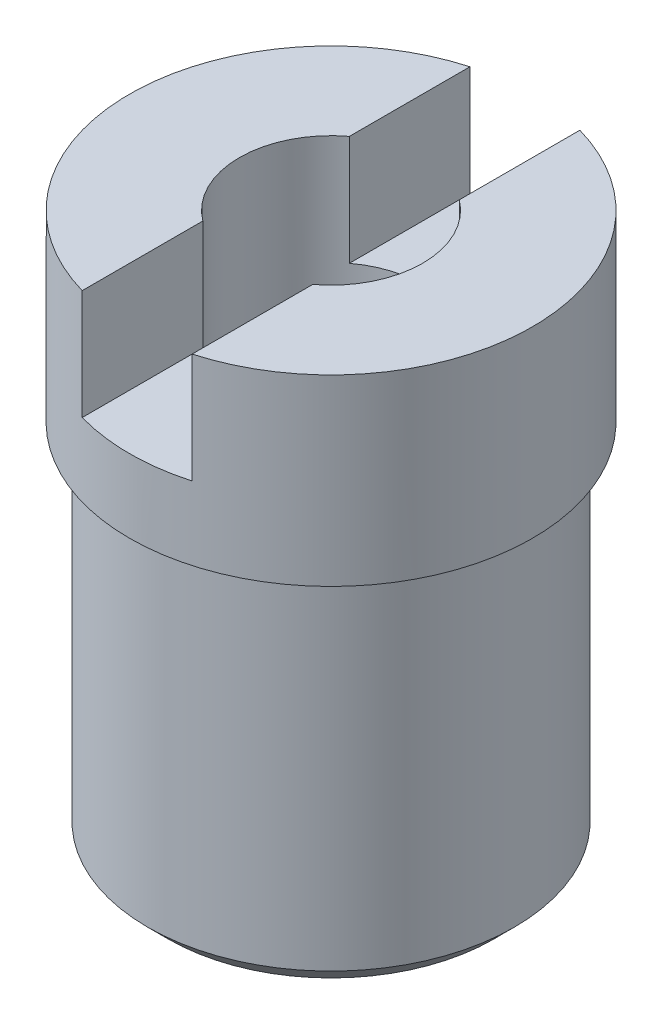
ISO-10303-21;
HEADER;
FILE_DESCRIPTION(('STEP AP214'),'2;1');
FILE_NAME('part.step','',(''),(''),'','','');
FILE_SCHEMA(('AUTOMOTIVE_DESIGN { 1 0 10303 214 1 1 1 1 }'));
ENDSEC;
DATA;
#1=APPLICATION_CONTEXT('core data for automotive mechanical design processes');
#2=APPLICATION_PROTOCOL_DEFINITION('international standard','automotive_design',2000,#1);
#3=PRODUCT_CONTEXT('',#1,'mechanical');
#4=PRODUCT('Part','Part','',(#3));
#5=PRODUCT_RELATED_PRODUCT_CATEGORY('part','',(#4));
#6=PRODUCT_DEFINITION_FORMATION('','',#4);
#7=PRODUCT_DEFINITION_CONTEXT('part definition',#1,'design');
#8=PRODUCT_DEFINITION('design','',#6,#7);
#9=PRODUCT_DEFINITION_SHAPE('','',#8);
#10=(LENGTH_UNIT() NAMED_UNIT(*) SI_UNIT(.MILLI.,.METRE.));
#11=(NAMED_UNIT(*) PLANE_ANGLE_UNIT() SI_UNIT($,.RADIAN.));
#12=(NAMED_UNIT(*) SI_UNIT($,.STERADIAN.) SOLID_ANGLE_UNIT());
#13=UNCERTAINTY_MEASURE_WITH_UNIT(LENGTH_MEASURE(1.E-05),#10,'distance_accuracy_value','');
#14=(GEOMETRIC_REPRESENTATION_CONTEXT(3) GLOBAL_UNCERTAINTY_ASSIGNED_CONTEXT((#13)) GLOBAL_UNIT_ASSIGNED_CONTEXT((#10,
#11,#12)) REPRESENTATION_CONTEXT('',''));
#15=CARTESIAN_POINT('',(0.,0.,0.));
#16=DIRECTION('',(0.,0.,1.));
#17=DIRECTION('',(1.,0.,0.));
#18=AXIS2_PLACEMENT_3D('',#15,#16,#17);
#19=CARTESIAN_POINT('',(0.,0.,0.));
#20=DIRECTION('',(0.,1.,0.));
#21=DIRECTION('',(0.,0.,1.));
#22=AXIS2_PLACEMENT_3D('',#19,#20,#21);
#23=PLANE('',#22);
#24=CARTESIAN_POINT('',(0.,0.,0.));
#25=DIRECTION('',(0.,1.,0.));
#26=DIRECTION('',(0.,0.,1.));
#27=AXIS2_PLACEMENT_3D('',#24,#25,#26);
#28=CIRCLE('',#27,2.5);
#29=CARTESIAN_POINT('',(1.0226917607471,0.,2.28125));
#30=VERTEX_POINT('',#29);
#31=CARTESIAN_POINT('',(2.4869663327568,0.,-0.254947954951986));
#32=VERTEX_POINT('',#31);
#33=EDGE_CURVE('E265',#30,#32,#28,.T.);
#34=ORIENTED_EDGE('',*,*,#33,.T.);
#35=CARTESIAN_POINT('',(2.59807621135331,0.,-1.50000000000001));
#36=DIRECTION('',(0.,-1.,0.));
#37=DIRECTION('',(-0.866025403784436,0.,0.500000000000004));
#38=AXIS2_PLACEMENT_3D('',#35,#36,#37);
#39=CIRCLE('',#38,1.25);
#40=CARTESIAN_POINT('',(1.46427457200969,0.,-2.02630204504803));
#41=VERTEX_POINT('',#40);
#42=EDGE_CURVE('E170',#41,#32,#39,.T.);
#43=ORIENTED_EDGE('',*,*,#42,.F.);
#44=CARTESIAN_POINT('',(-1.46427457200972,0.,-2.02630204504801));
#45=VERTEX_POINT('',#44);
#46=EDGE_CURVE('E169',#41,#45,#28,.T.);
#47=ORIENTED_EDGE('',*,*,#46,.T.);
#48=CARTESIAN_POINT('',(-2.59807621135333,0.,-1.49999999999998));
#49=DIRECTION('',(0.,-1.,0.));
#50=DIRECTION('',(0.866025403784443,0.,0.499999999999992));
#51=AXIS2_PLACEMENT_3D('',#48,#49,#50);
#52=CIRCLE('',#51,1.25);
#53=CARTESIAN_POINT('',(-2.4869663327568,0.,-0.254947954951952));
#54=VERTEX_POINT('',#53);
#55=EDGE_CURVE('E159',#54,#45,#52,.T.);
#56=ORIENTED_EDGE('',*,*,#55,.F.);
#57=CARTESIAN_POINT('',(-1.0226917607471,0.,2.28125));
#58=VERTEX_POINT('',#57);
#59=EDGE_CURVE('E291',#54,#58,#28,.T.);
#60=ORIENTED_EDGE('',*,*,#59,.T.);
#61=CARTESIAN_POINT('',(0.,0.,3.));
#62=DIRECTION('',(0.,-1.,0.));
#63=DIRECTION('',(0.,0.,-1.));
#64=AXIS2_PLACEMENT_3D('',#61,#62,#63);
#65=CIRCLE('',#64,1.25);
#66=EDGE_CURVE('E172',#30,#58,#65,.T.);
#67=ORIENTED_EDGE('',*,*,#66,.F.);
#68=EDGE_LOOP('',(#34,#43,#47,#56,#60,#67));
#69=FACE_BOUND('',#68,.T.);
#70=CARTESIAN_POINT('',(0.,0.,0.));
#71=DIRECTION('',(0.,1.,0.));
#72=DIRECTION('',(0.,0.,1.));
#73=AXIS2_PLACEMENT_3D('',#70,#71,#72);
#74=CIRCLE('',#73,4.4455);
#75=CARTESIAN_POINT('',(0.,0.,4.4455));
#76=VERTEX_POINT('',#75);
#77=EDGE_CURVE('E339',#76,#76,#74,.T.);
#78=ORIENTED_EDGE('',*,*,#77,.F.);
#79=EDGE_LOOP('',(#78));
#80=FACE_BOUND('',#79,.T.);
#81=ADVANCED_FACE('F47',(#69,#80),#23,.F.);
#82=CARTESIAN_POINT('',(0.,15.,0.));
#83=DIRECTION('',(0.,1.,0.));
#84=DIRECTION('',(0.,0.,1.));
#85=AXIS2_PLACEMENT_3D('',#82,#83,#84);
#86=PLANE('',#85);
#87=DIRECTION('',(0.,0.,-1.));
#88=VECTOR('',#87,1.);
#89=CARTESIAN_POINT('',(1.5,15.,6.34091833191656));
#90=LINE('',#89,#88);
#91=CARTESIAN_POINT('',(1.5,15.,5.29150262212918));
#92=VERTEX_POINT('',#91);
#93=CARTESIAN_POINT('',(1.5,15.,2.));
#94=VERTEX_POINT('',#93);
#95=EDGE_CURVE('E305',#92,#94,#90,.T.);
#96=ORIENTED_EDGE('',*,*,#95,.F.);
#97=CARTESIAN_POINT('',(0.,15.,0.));
#98=DIRECTION('',(0.,1.,0.));
#99=DIRECTION('',(0.,0.,1.));
#100=AXIS2_PLACEMENT_3D('',#97,#98,#99);
#101=CIRCLE('',#100,5.5);
#102=CARTESIAN_POINT('',(1.5,15.,-5.29150262212918));
#103=VERTEX_POINT('',#102);
#104=EDGE_CURVE('E248',#92,#103,#101,.T.);
#105=ORIENTED_EDGE('',*,*,#104,.T.);
#106=CARTESIAN_POINT('',(1.5,15.,-2.));
#107=VERTEX_POINT('',#106);
#108=EDGE_CURVE('E306',#107,#103,#90,.T.);
#109=ORIENTED_EDGE('',*,*,#108,.F.);
#110=CARTESIAN_POINT('',(0.,15.,0.));
#111=DIRECTION('',(0.,1.,0.));
#112=DIRECTION('',(0.,0.,1.));
#113=AXIS2_PLACEMENT_3D('',#110,#111,#112);
#114=CIRCLE('',#113,2.5);
#115=EDGE_CURVE('E263',#94,#107,#114,.T.);
#116=ORIENTED_EDGE('',*,*,#115,.F.);
#117=EDGE_LOOP('',(#96,#105,#109,#116));
#118=FACE_BOUND('',#117,.T.);
#119=ADVANCED_FACE('F231',(#118),#86,.T.);
#120=DIRECTION('',(0.,0.,1.));
#121=VECTOR('',#120,1.);
#122=CARTESIAN_POINT('',(-1.5,15.,6.34091833191656));
#123=LINE('',#122,#121);
#124=CARTESIAN_POINT('',(-1.5,15.,-5.29150262212918));
#125=VERTEX_POINT('',#124);
#126=CARTESIAN_POINT('',(-1.5,15.,-2.));
#127=VERTEX_POINT('',#126);
#128=EDGE_CURVE('E318',#125,#127,#123,.T.);
#129=ORIENTED_EDGE('',*,*,#128,.F.);
#130=CARTESIAN_POINT('',(-1.5,15.,5.29150262212918));
#131=VERTEX_POINT('',#130);
#132=EDGE_CURVE('E257',#125,#131,#101,.T.);
#133=ORIENTED_EDGE('',*,*,#132,.T.);
#134=CARTESIAN_POINT('',(-1.5,15.,2.));
#135=VERTEX_POINT('',#134);
#136=EDGE_CURVE('E310',#135,#131,#123,.T.);
#137=ORIENTED_EDGE('',*,*,#136,.F.);
#138=EDGE_CURVE('E290',#127,#135,#114,.T.);
#139=ORIENTED_EDGE('',*,*,#138,.F.);
#140=EDGE_LOOP('',(#129,#133,#137,#139));
#141=FACE_BOUND('',#140,.T.);
#142=ADVANCED_FACE('F228',(#141),#86,.T.);
#143=CARTESIAN_POINT('',(0.,15.,0.));
#144=DIRECTION('',(0.,-1.,0.));
#145=DIRECTION('',(0.,0.,-1.));
#146=AXIS2_PLACEMENT_3D('',#143,#144,#145);
#147=CYLINDRICAL_SURFACE('',#146,5.5);
#148=CARTESIAN_POINT('',(0.,10.,0.));
#149=DIRECTION('',(0.,1.,0.));
#150=DIRECTION('',(0.,0.,1.));
#151=AXIS2_PLACEMENT_3D('',#148,#149,#150);
#152=CIRCLE('',#151,5.5);
#153=CARTESIAN_POINT('',(0.,10.,5.5));
#154=VERTEX_POINT('',#153);
#155=EDGE_CURVE('E243',#154,#154,#152,.T.);
#156=ORIENTED_EDGE('',*,*,#155,.T.);
#157=EDGE_LOOP('',(#156));
#158=FACE_BOUND('',#157,.T.);
#159=ORIENTED_EDGE('',*,*,#104,.F.);
#160=DIRECTION('',(0.,-1.,0.));
#161=VECTOR('',#160,1.);
#162=CARTESIAN_POINT('',(1.5,15.,5.29150262212918));
#163=LINE('',#162,#161);
#164=CARTESIAN_POINT('',(1.5,12.,5.29150262212918));
#165=VERTEX_POINT('',#164);
#166=EDGE_CURVE('E250',#92,#165,#163,.T.);
#167=ORIENTED_EDGE('',*,*,#166,.T.);
#168=CARTESIAN_POINT('',(0.,12.,0.));
#169=DIRECTION('',(0.,-1.,0.));
#170=DIRECTION('',(0.,0.,-1.));
#171=AXIS2_PLACEMENT_3D('',#168,#169,#170);
#172=CIRCLE('',#171,5.5);
#173=CARTESIAN_POINT('',(-1.5,12.,5.29150262212918));
#174=VERTEX_POINT('',#173);
#175=EDGE_CURVE('E321',#165,#174,#172,.T.);
#176=ORIENTED_EDGE('',*,*,#175,.T.);
#177=DIRECTION('',(0.,-1.,0.));
#178=VECTOR('',#177,1.);
#179=CARTESIAN_POINT('',(-1.5,15.,5.29150262212918));
#180=LINE('',#179,#178);
#181=EDGE_CURVE('E323',#174,#131,#180,.F.);
#182=ORIENTED_EDGE('',*,*,#181,.T.);
#183=ORIENTED_EDGE('',*,*,#132,.F.);
#184=DIRECTION('',(0.,-1.,0.));
#185=VECTOR('',#184,1.);
#186=CARTESIAN_POINT('',(-1.5,15.,-5.29150262212918));
#187=LINE('',#186,#185);
#188=CARTESIAN_POINT('',(-1.5,12.,-5.29150262212918));
#189=VERTEX_POINT('',#188);
#190=EDGE_CURVE('E296',#125,#189,#187,.T.);
#191=ORIENTED_EDGE('',*,*,#190,.T.);
#192=CARTESIAN_POINT('',(1.5,12.,-5.29150262212918));
#193=VERTEX_POINT('',#192);
#194=EDGE_CURVE('E319',#189,#193,#172,.T.);
#195=ORIENTED_EDGE('',*,*,#194,.T.);
#196=DIRECTION('',(0.,-1.,0.));
#197=VECTOR('',#196,1.);
#198=CARTESIAN_POINT('',(1.5,15.,-5.29150262212918));
#199=LINE('',#198,#197);
#200=EDGE_CURVE('E252',#193,#103,#199,.F.);
#201=ORIENTED_EDGE('',*,*,#200,.T.);
#202=EDGE_LOOP('',(#159,#167,#176,#182,#183,#191,#195,#201));
#203=FACE_BOUND('',#202,.T.);
#204=ADVANCED_FACE('F227',(#158,#203),#147,.T.);
#205=CARTESIAN_POINT('',(0.,15.,0.));
#206=DIRECTION('',(0.,-1.,0.));
#207=DIRECTION('',(0.,0.,-1.));
#208=AXIS2_PLACEMENT_3D('',#205,#206,#207);
#209=CYLINDRICAL_SURFACE('',#208,2.5);
#210=DIRECTION('',(0.,-1.,0.));
#211=VECTOR('',#210,1.);
#212=CARTESIAN_POINT('',(2.4869663327568,1.,-0.254947954951986));
#213=LINE('',#212,#211);
#214=CARTESIAN_POINT('',(2.4869663327568,0.75,-0.254947954951988));
#215=VERTEX_POINT('',#214);
#216=EDGE_CURVE('E68',#32,#215,#213,.F.);
#217=ORIENTED_EDGE('',*,*,#216,.F.);
#218=ORIENTED_EDGE('',*,*,#33,.F.);
#219=DIRECTION('',(0.,-1.,0.));
#220=VECTOR('',#219,1.);
#221=CARTESIAN_POINT('',(1.0226917607471,1.,2.28125));
#222=LINE('',#221,#220);
#223=CARTESIAN_POINT('',(1.0226917607471,0.75,2.28125));
#224=VERTEX_POINT('',#223);
#225=EDGE_CURVE('E277',#224,#30,#222,.T.);
#226=ORIENTED_EDGE('',*,*,#225,.F.);
#227=CARTESIAN_POINT('',(1.0226917607471,0.75,2.28125));
#228=CARTESIAN_POINT('',(1.02268923826187,0.783960583351303,2.2812469305784));
#229=CARTESIAN_POINT('',(1.02140488961309,0.817905340748756,2.28182740345297));
#230=CARTESIAN_POINT('',(1.01626563083512,0.885562785121827,2.28412253624071));
#231=CARTESIAN_POINT('',(1.01241058498996,0.919275459750053,2.28583725603466));
#232=CARTESIAN_POINT('',(0.996976429068466,1.0197776092706,2.29263457753815));
#233=CARTESIAN_POINT('',(0.981528294122227,1.08591243091071,2.29937030722085));
#234=CARTESIAN_POINT('',(0.940354344943999,1.21445288808607,2.31651174414605));
#235=CARTESIAN_POINT('',(0.914617858764476,1.27685457378549,2.32692126083337));
#236=CARTESIAN_POINT('',(0.8530195512582,1.39594052180133,2.3501994336849));
#237=CARTESIAN_POINT('',(0.817163269610427,1.45262788921624,2.3630667431862));
#238=CARTESIAN_POINT('',(0.736928585619027,1.55673094448281,2.38928008972033));
#239=CARTESIAN_POINT('',(0.692836757647234,1.60437301490112,2.40260034356706));
#240=CARTESIAN_POINT('',(0.596237285625027,1.69052561372186,2.42837141413324));
#241=CARTESIAN_POINT('',(0.543734276627453,1.72904114256955,2.44082270430844));
#242=CARTESIAN_POINT('',(0.437177333797315,1.79187294115649,2.46201766350419));
#243=CARTESIAN_POINT('',(0.383773533247553,1.81720739337908,2.47100444003221));
#244=CARTESIAN_POINT('',(0.272832812437004,1.85773899832905,2.48569487812851));
#245=CARTESIAN_POINT('',(0.215299825591653,1.87294566034285,2.49140161872918));
#246=CARTESIAN_POINT('',(0.104693768715796,1.89135333324006,2.49835240245533));
#247=CARTESIAN_POINT('',(0.0518360243682777,1.89570117790759,2.50002207283593));
#248=CARTESIAN_POINT('',(-0.0538612831971405,1.89558559597544,2.49997751724426));
#249=CARTESIAN_POINT('',(-0.106700846881092,1.89112495389512,2.4982643606438));
#250=CARTESIAN_POINT('',(-0.208187773468863,1.87402482089377,2.49181089024588));
#251=CARTESIAN_POINT('',(-0.256914285655039,1.86179138681044,2.487221011781));
#252=CARTESIAN_POINT('',(-0.351602191733541,1.83000959559745,2.4756116166155));
#253=CARTESIAN_POINT('',(-0.397563359008247,1.81046063991231,2.46859190110928));
#254=CARTESIAN_POINT('',(-0.48736202281161,1.76386246088231,2.45247607929658));
#255=CARTESIAN_POINT('',(-0.531054703270947,1.73655887798503,2.44331182822218));
#256=CARTESIAN_POINT('',(-0.613555850122808,1.67568707107459,2.42391188603059));
#257=CARTESIAN_POINT('',(-0.652362482928881,1.64211650691568,2.41367579530805));
#258=CARTESIAN_POINT('',(-0.728000623457904,1.56616760687997,2.39200947952257));
#259=CARTESIAN_POINT('',(-0.764288253991373,1.52325396304738,2.38055867801289));
#260=CARTESIAN_POINT('',(-0.829926069619005,1.43223750160701,2.35847927207022));
#261=CARTESIAN_POINT('',(-0.859273894316626,1.38413292651589,2.34785094820638));
#262=CARTESIAN_POINT('',(-0.913518753078359,1.27865126250312,2.32731913783819));
#263=CARTESIAN_POINT('',(-0.937628216713635,1.22083065743162,2.31760801123143));
#264=CARTESIAN_POINT('',(-0.976997334457977,1.10182562637235,2.30128893492734));
#265=CARTESIAN_POINT('',(-0.992251562115499,1.0406391628863,2.29468288848093));
#266=CARTESIAN_POINT('',(-1.01458302628525,0.912195007724292,2.28490403841708));
#267=CARTESIAN_POINT('',(-1.02103870107113,0.844806313087231,2.2819931251287));
#268=CARTESIAN_POINT('',(-1.02310138685888,0.743606889913173,2.28106530522077));
#269=CARTESIAN_POINT('',(-1.02251686719093,0.709839413879867,2.28133000109251));
#270=CARTESIAN_POINT('',(-1.01880736772819,0.642473464027681,2.2829876225502));
#271=CARTESIAN_POINT('',(-1.01568248974898,0.608874983489896,2.28438050291941));
#272=CARTESIAN_POINT('',(-1.01128966572601,0.575458588223356,2.28632745073751));
#273=B_SPLINE_CURVE_WITH_KNOTS('',3,(#227,#228,#229,#230,#231,#232,#233,#234,#235,#236,#237,
#238,#239,#240,#241,#242,#243,#244,#245,#246,#247,#248,#249,#250,#251,#252,#253,#254,#255,#256,
#257,#258,#259,#260,#261,#262,#263,#264,#265,#266,#267,#268,#269,#270,#271,#272),.UNSPECIFIED.,
.F.,.F.,(4,2,2,2,2,2,2,2,2,2,2,2,2,2,2,2,2,2,2,2,2,2,4),(0.,0.101820849297489,0.203647074494542,
0.407355165035726,0.611275109401976,0.815083641708468,1.01280389626566,1.21041556781954,
1.38876326330348,1.56694326581107,1.72531290728472,1.88363249331177,2.03429398541653,
2.18496780733071,2.34130664062493,2.49770396940676,2.66905933148204,2.84047289211655,
3.02983117401864,3.21930537172435,3.42157116473086,3.52279350423826,3.62401178703391),.UNSPECIFIED.);
#274=CARTESIAN_POINT('',(-1.0226917607471,0.75,2.28125));
#275=VERTEX_POINT('',#274);
#276=EDGE_CURVE('E11',#224,#275,#273,.T.);
#277=ORIENTED_EDGE('',*,*,#276,.T.);
#278=DIRECTION('',(0.,-1.,0.));
#279=VECTOR('',#278,1.);
#280=CARTESIAN_POINT('',(-1.0226917607471,1.,2.28125));
#281=LINE('',#280,#279);
#282=EDGE_CURVE('E279',#58,#275,#281,.F.);
#283=ORIENTED_EDGE('',*,*,#282,.F.);
#284=ORIENTED_EDGE('',*,*,#59,.F.);
#285=DIRECTION('',(0.,-1.,0.));
#286=VECTOR('',#285,1.);
#287=CARTESIAN_POINT('',(-2.4869663327568,1.,-0.254947954951952));
#288=LINE('',#287,#286);
#289=CARTESIAN_POINT('',(-2.4869663327568,0.75,-0.254947954951952));
#290=VERTEX_POINT('',#289);
#291=EDGE_CURVE('E347',#290,#54,#288,.T.);
#292=ORIENTED_EDGE('',*,*,#291,.F.);
#293=CARTESIAN_POINT('',(-2.4869663327568,0.75,-0.254947954951953));
#294=CARTESIAN_POINT('',(-2.48696241331711,0.783960583351303,-0.254948604777444));
#295=CARTESIAN_POINT('',(-2.4868229432483,0.817905340748756,-0.256351119771887));
#296=CARTESIAN_POINT('',(-2.48624095715856,0.885562785121827,-0.261949414824099));
#297=CARTESIAN_POINT('',(-2.48579842513792,0.919275459750053,-0.266145342355734));
#298=CARTESIAN_POINT('',(-2.48396800027687,1.0197776092706,-0.282910374221464));
#299=CARTESIAN_POINT('',(-2.482077245822,1.08591243091071,-0.299656716367349));
#300=CARTESIAN_POINT('',(-2.47633519106748,1.21445288808607,-0.343885120792423));
#301=CARTESIAN_POINT('',(-2.47248185387006,1.27685457378549,-0.3713783299717));
#302=CARTESIAN_POINT('',(-2.46184218916003,1.39594052180133,-0.436363115528025));
#303=CARTESIAN_POINT('',(-2.45505746524263,1.45262788921624,-0.473849221070897));
#304=CARTESIAN_POINT('',(-2.43764154726369,1.55673094448281,-0.55644116893913));
#305=CARTESIAN_POINT('',(-2.42713131149392,1.60437301490112,-0.601285938985362));
#306=CARTESIAN_POINT('',(-2.40114997727585,1.69052561372186,-0.697829071031845));
#307=CARTESIAN_POINT('',(-2.38568160637868,1.72904114256955,-0.74952365568647));
#308=CARTESIAN_POINT('',(-2.3507585080593,1.79187294115649,-0.85240215472485));
#309=CARTESIAN_POINT('',(-2.33183938455582,1.81720739337908,-0.903144590923591));
#310=CARTESIAN_POINT('',(-2.28909131673467,1.85773899832905,-1.00656729250783));
#311=CARTESIAN_POINT('',(-2.26526700564498,1.87294566034285,-1.05924569097184));
#312=CARTESIAN_POINT('',(-2.21598353249011,1.89135333324006,-1.15850873790183));
#313=CARTESIAN_POINT('',(-2.19100063728189,1.89570117790759,-1.20511972248382));
#314=CARTESIAN_POINT('',(-2.13811339722492,1.89558559597544,-1.29663399815126));
#315=CARTESIAN_POINT('',(-2.11020997824629,1.89112495389512,-1.34153782432622));
#316=CARTESIAN_POINT('',(-2.05387764564523,1.87402482089377,-1.42620134570428));
#317=CARTESIAN_POINT('',(-2.02553943820128,1.86179138681044,-1.46610480386288));
#318=CARTESIAN_POINT('',(-1.96814145402612,1.83000959559745,-1.54230223837526));
#319=CARTESIAN_POINT('',(-1.93908161843305,1.81046063991231,-1.57859591906964));
#320=CARTESIAN_POINT('',(-1.88022557543871,1.76386246088231,-1.6483059322429));
#321=CARTESIAN_POINT('',(-1.85044276097195,1.73655887798503,-1.68156277794292));
#322=CARTESIAN_POINT('',(-1.79239134477615,1.67568707107459,-1.74331089586219));
#323=CARTESIAN_POINT('',(-1.76412331377195,1.64211650691568,-1.77180038034631));
#324=CARTESIAN_POINT('',(-1.7075406636308,1.56616760687997,-1.82647177364672));
#325=CARTESIAN_POINT('',(-1.67948016336299,1.52325396304738,-1.85217238277701));
#326=CARTESIAN_POINT('',(-1.62753992910236,1.43223750160701,-1.89797669558813));
#327=CARTESIAN_POINT('',(-1.60366161828781,1.38413292651589,-1.91807849539016));
#328=CARTESIAN_POINT('',(-1.55875811954241,1.27865126250312,-1.95479001591842));
#329=CARTESIAN_POINT('',(-1.53829330538395,1.22083065743162,-1.97081386059481));
#330=CARTESIAN_POINT('',(-1.50447601186614,1.10182562637235,-1.99674897853394));
#331=CARTESIAN_POINT('',(-1.49112789399621,1.0406391628863,-2.00665650397727));
#332=CARTESIAN_POINT('',(-1.47149342933624,0.912195007724292,-2.02110669422005));
#333=CARTESIAN_POINT('',(-1.46574466708735,0.844806313087231,-2.025242015939));
#334=CARTESIAN_POINT('',(-1.46390980858307,0.743606889913173,-2.02656444427726));
#335=CARTESIAN_POINT('',(-1.46443130176625,0.709839413879867,-2.02619058333166));
#336=CARTESIAN_POINT('',(-1.46772159378984,0.642473464027681,-2.02380687329046));
#337=CARTESIAN_POINT('',(-1.47049030256361,0.608874983489896,-2.02179708976134));
#338=CARTESIAN_POINT('',(-1.47437282084542,0.575458588223356,-2.01896626647214));
#339=B_SPLINE_CURVE_WITH_KNOTS('',3,(#293,#294,#295,#296,#297,#298,#299,#300,#301,#302,#303,
#304,#305,#306,#307,#308,#309,#310,#311,#312,#313,#314,#315,#316,#317,#318,#319,#320,#321,#322,
#323,#324,#325,#326,#327,#328,#329,#330,#331,#332,#333,#334,#335,#336,#337,#338),.UNSPECIFIED.,
.F.,.F.,(4,2,2,2,2,2,2,2,2,2,2,2,2,2,2,2,2,2,2,2,2,2,4),(0.,0.101820849297489,0.203647074494542,
0.407355165035726,0.611275109401976,0.815083641708468,1.01280389626566,1.21041556781954,
1.38876326330348,1.56694326581107,1.72531290728472,1.88363249331177,2.03429398541653,
2.18496780733071,2.34130664062493,2.49770396940676,2.66905933148204,2.84047289211655,
3.02983117401864,3.21930537172435,3.42157116473086,3.52279350423826,3.62401178703391),.UNSPECIFIED.);
#340=CARTESIAN_POINT('',(-1.46427457200972,0.75,-2.02630204504801));
#341=VERTEX_POINT('',#340);
#342=EDGE_CURVE('E176',#290,#341,#339,.T.);
#343=ORIENTED_EDGE('',*,*,#342,.T.);
#344=DIRECTION('',(0.,-1.,0.));
#345=VECTOR('',#344,1.);
#346=CARTESIAN_POINT('',(-1.46427457200972,1.,-2.02630204504801));
#347=LINE('',#346,#345);
#348=EDGE_CURVE('E76',#45,#341,#347,.F.);
#349=ORIENTED_EDGE('',*,*,#348,.F.);
#350=ORIENTED_EDGE('',*,*,#46,.F.);
#351=DIRECTION('',(0.,-1.,0.));
#352=VECTOR('',#351,1.);
#353=CARTESIAN_POINT('',(1.46427457200969,1.,-2.02630204504803));
#354=LINE('',#353,#352);
#355=CARTESIAN_POINT('',(1.46427457200969,0.75,-2.02630204504803));
#356=VERTEX_POINT('',#355);
#357=EDGE_CURVE('E162',#356,#41,#354,.T.);
#358=ORIENTED_EDGE('',*,*,#357,.F.);
#359=CARTESIAN_POINT('',(1.46427457200969,0.75,-2.02630204504803));
#360=CARTESIAN_POINT('',(1.46427317505523,0.783960583351303,-2.02629832580094));
#361=CARTESIAN_POINT('',(1.4654180536352,0.817905340748756,-2.02547628368106));
#362=CARTESIAN_POINT('',(1.46997532632343,0.885562785121827,-2.0221731214166));
#363=CARTESIAN_POINT('',(1.47338784014794,0.919275459750052,-2.01969191367891));
#364=CARTESIAN_POINT('',(1.4869915712084,1.0197776092706,-2.00972420331667));
#365=CARTESIAN_POINT('',(1.50054895169976,1.08591243091071,-1.99971359085349));
#366=CARTESIAN_POINT('',(1.53598084612347,1.21445288808607,-1.97262662335361));
#367=CARTESIAN_POINT('',(1.55786399510557,1.27685457378549,-1.95554293086166));
#368=CARTESIAN_POINT('',(1.60882263790182,1.39594052180133,-1.91383631815686));
#369=CARTESIAN_POINT('',(1.63789419563219,1.45262788921624,-1.88921752211529));
#370=CARTESIAN_POINT('',(1.70071296164465,1.55673094448281,-1.83283892078119));
#371=CARTESIAN_POINT('',(1.73429455384667,1.60437301490112,-1.80131440458169));
#372=CARTESIAN_POINT('',(1.8049126916508,1.69052561372186,-1.73054234310138));
#373=CARTESIAN_POINT('',(1.84194732975121,1.72904114256955,-1.69129904862196));
#374=CARTESIAN_POINT('',(1.91358117426197,1.79187294115649,-1.60961550877933));
#375=CARTESIAN_POINT('',(1.94806585130825,1.81720739337908,-1.56785984910861));
#376=CARTESIAN_POINT('',(2.01625850429765,1.85773899832905,-1.47912758562067));
#377=CARTESIAN_POINT('',(2.04996718005331,1.87294566034285,-1.43215592775733));
#378=CARTESIAN_POINT('',(2.1112897637743,1.89135333324006,-1.33984366455349));
#379=CARTESIAN_POINT('',(2.1391646129136,1.89570117790759,-1.29490235035209));
#380=CARTESIAN_POINT('',(2.19197468042205,1.89558559597544,-1.20334351909299));
#381=CARTESIAN_POINT('',(2.21691082512736,1.89112495389512,-1.15672653631757));
#382=CARTESIAN_POINT('',(2.26206541911408,1.87402482089377,-1.06560954454159));
#383=CARTESIAN_POINT('',(2.2824537238563,1.86179138681044,-1.02111620791812));
#384=CARTESIAN_POINT('',(2.31974364575965,1.83000959559745,-0.933309378240225));
#385=CARTESIAN_POINT('',(2.33664497744128,1.81046063991231,-0.889995982039637));
#386=CARTESIAN_POINT('',(2.3675875982503,1.76386246088231,-0.804170147053676));
#387=CARTESIAN_POINT('',(2.38149746424288,1.73655887798503,-0.761749050279254));
#388=CARTESIAN_POINT('',(2.40594719489894,1.67568707107459,-0.680600990168395));
#389=CARTESIAN_POINT('',(2.41648579670082,1.64211650691568,-0.641875414961732));
#390=CARTESIAN_POINT('',(2.43554128708869,1.56616760687997,-0.565537705875841));
#391=CARTESIAN_POINT('',(2.44376841735434,1.52325396304738,-0.528386295235872));
#392=CARTESIAN_POINT('',(2.45746599872134,1.43223750160701,-0.460502576482092));
#393=CARTESIAN_POINT('',(2.46293551260442,1.38413292651589,-0.429772452816217));
#394=CARTESIAN_POINT('',(2.47227687262075,1.27865126250312,-0.372529121919764));
#395=CARTESIAN_POINT('',(2.47592152209757,1.22083065743162,-0.346794150636619));
#396=CARTESIAN_POINT('',(2.48147334632409,1.10182562637235,-0.30453995639339));
#397=CARTESIAN_POINT('',(2.48337945611169,1.0406391628863,-0.288026384503661));
#398=CARTESIAN_POINT('',(2.48607645562147,0.912195007724292,-0.263797344197029));
#399=CARTESIAN_POINT('',(2.48678336815846,0.844806313087231,-0.2567511091897));
#400=CARTESIAN_POINT('',(2.48701119544194,0.743606889913173,-0.254500860943516));
#401=CARTESIAN_POINT('',(2.48694816895716,0.709839413879867,-0.255139417760845));
#402=CARTESIAN_POINT('',(2.48652896151801,0.642473464027681,-0.259180749259743));
#403=CARTESIAN_POINT('',(2.48617279231257,0.608874983489896,-0.262583413158072));
#404=CARTESIAN_POINT('',(2.48566248657141,0.575458588223356,-0.267361184265371));
#405=B_SPLINE_CURVE_WITH_KNOTS('',3,(#359,#360,#361,#362,#363,#364,#365,#366,#367,#368,#369,
#370,#371,#372,#373,#374,#375,#376,#377,#378,#379,#380,#381,#382,#383,#384,#385,#386,#387,#388,
#389,#390,#391,#392,#393,#394,#395,#396,#397,#398,#399,#400,#401,#402,#403,#404),.UNSPECIFIED.,
.F.,.F.,(4,2,2,2,2,2,2,2,2,2,2,2,2,2,2,2,2,2,2,2,2,2,4),(0.,0.101820849297489,0.203647074494542,
0.407355165035726,0.611275109401976,0.815083641708468,1.01280389626566,1.21041556781954,
1.38876326330348,1.56694326581107,1.72531290728472,1.88363249331177,2.03429398541653,
2.18496780733071,2.34130664062493,2.49770396940676,2.66905933148204,2.84047289211655,
3.02983117401864,3.21930537172435,3.42157116473086,3.52279350423826,3.62401178703391),.UNSPECIFIED.);
#406=EDGE_CURVE('E154',#356,#215,#405,.T.);
#407=ORIENTED_EDGE('',*,*,#406,.T.);
#408=EDGE_LOOP('',(#217,#218,#226,#277,#283,#284,#292,#343,#349,#350,#358,#407));
#409=FACE_BOUND('',#408,.T.);
#410=DIRECTION('',(0.,-1.,0.));
#411=VECTOR('',#410,1.);
#412=CARTESIAN_POINT('',(1.5,15.,2.));
#413=LINE('',#412,#411);
#414=CARTESIAN_POINT('',(1.5,12.,2.));
#415=VERTEX_POINT('',#414);
#416=EDGE_CURVE('E274',#94,#415,#413,.T.);
#417=ORIENTED_EDGE('',*,*,#416,.F.);
#418=ORIENTED_EDGE('',*,*,#115,.T.);
#419=DIRECTION('',(0.,-1.,0.));
#420=VECTOR('',#419,1.);
#421=CARTESIAN_POINT('',(1.5,15.,-2.));
#422=LINE('',#421,#420);
#423=CARTESIAN_POINT('',(1.5,12.,-2.));
#424=VERTEX_POINT('',#423);
#425=EDGE_CURVE('E270',#424,#107,#422,.F.);
#426=ORIENTED_EDGE('',*,*,#425,.F.);
#427=CARTESIAN_POINT('',(0.,12.,0.));
#428=DIRECTION('',(0.,-1.,0.));
#429=DIRECTION('',(0.,0.,-1.));
#430=AXIS2_PLACEMENT_3D('',#427,#428,#429);
#431=CIRCLE('',#430,2.5);
#432=CARTESIAN_POINT('',(-1.5,12.,-2.));
#433=VERTEX_POINT('',#432);
#434=EDGE_CURVE('E256',#433,#424,#431,.T.);
#435=ORIENTED_EDGE('',*,*,#434,.F.);
#436=DIRECTION('',(0.,-1.,0.));
#437=VECTOR('',#436,1.);
#438=CARTESIAN_POINT('',(-1.5,15.,-2.));
#439=LINE('',#438,#437);
#440=EDGE_CURVE('E259',#127,#433,#439,.T.);
#441=ORIENTED_EDGE('',*,*,#440,.F.);
#442=ORIENTED_EDGE('',*,*,#138,.T.);
#443=DIRECTION('',(0.,-1.,0.));
#444=VECTOR('',#443,1.);
#445=CARTESIAN_POINT('',(-1.5,15.,2.));
#446=LINE('',#445,#444);
#447=CARTESIAN_POINT('',(-1.5,12.,2.));
#448=VERTEX_POINT('',#447);
#449=EDGE_CURVE('E272',#448,#135,#446,.F.);
#450=ORIENTED_EDGE('',*,*,#449,.F.);
#451=EDGE_CURVE('E261',#415,#448,#431,.T.);
#452=ORIENTED_EDGE('',*,*,#451,.F.);
#453=EDGE_LOOP('',(#417,#418,#426,#435,#441,#442,#450,#452));
#454=FACE_BOUND('',#453,.T.);
#455=ADVANCED_FACE('F166',(#409,#454),#209,.F.);
#456=CARTESIAN_POINT('',(0.,12.,0.));
#457=DIRECTION('',(0.,-1.,0.));
#458=DIRECTION('',(0.,0.,-1.));
#459=AXIS2_PLACEMENT_3D('',#456,#457,#458);
#460=PLANE('',#459);
#461=DIRECTION('',(0.,0.,1.));
#462=VECTOR('',#461,1.);
#463=CARTESIAN_POINT('',(-1.5,12.,6.34091833191656));
#464=LINE('',#463,#462);
#465=EDGE_CURVE('E322',#189,#433,#464,.T.);
#466=ORIENTED_EDGE('',*,*,#465,.T.);
#467=ORIENTED_EDGE('',*,*,#434,.T.);
#468=DIRECTION('',(0.,0.,-1.));
#469=VECTOR('',#468,1.);
#470=CARTESIAN_POINT('',(1.5,12.,6.34091833191656));
#471=LINE('',#470,#469);
#472=EDGE_CURVE('E332',#424,#193,#471,.T.);
#473=ORIENTED_EDGE('',*,*,#472,.T.);
#474=ORIENTED_EDGE('',*,*,#194,.F.);
#475=EDGE_LOOP('',(#466,#467,#473,#474));
#476=FACE_BOUND('',#475,.T.);
#477=ADVANCED_FACE('F215',(#476),#460,.F.);
#478=CARTESIAN_POINT('',(-1.5,12.,6.34091833191656));
#479=DIRECTION('',(-1.,0.,0.));
#480=DIRECTION('',(0.,0.,1.));
#481=AXIS2_PLACEMENT_3D('',#478,#479,#480);
#482=PLANE('',#481);
#483=ORIENTED_EDGE('',*,*,#128,.T.);
#484=ORIENTED_EDGE('',*,*,#440,.T.);
#485=ORIENTED_EDGE('',*,*,#465,.F.);
#486=ORIENTED_EDGE('',*,*,#190,.F.);
#487=EDGE_LOOP('',(#483,#484,#485,#486));
#488=FACE_BOUND('',#487,.T.);
#489=ADVANCED_FACE('F216',(#488),#482,.F.);
#490=CARTESIAN_POINT('',(1.5,12.,6.34091833191656));
#491=DIRECTION('',(1.,0.,0.));
#492=DIRECTION('',(0.,0.,-1.));
#493=AXIS2_PLACEMENT_3D('',#490,#491,#492);
#494=PLANE('',#493);
#495=ORIENTED_EDGE('',*,*,#472,.F.);
#496=ORIENTED_EDGE('',*,*,#425,.T.);
#497=ORIENTED_EDGE('',*,*,#108,.T.);
#498=ORIENTED_EDGE('',*,*,#200,.F.);
#499=EDGE_LOOP('',(#495,#496,#497,#498));
#500=FACE_BOUND('',#499,.T.);
#501=ADVANCED_FACE('F219',(#500),#494,.F.);
#502=ORIENTED_EDGE('',*,*,#95,.T.);
#503=ORIENTED_EDGE('',*,*,#416,.T.);
#504=EDGE_CURVE('E334',#165,#415,#471,.T.);
#505=ORIENTED_EDGE('',*,*,#504,.F.);
#506=ORIENTED_EDGE('',*,*,#166,.F.);
#507=EDGE_LOOP('',(#502,#503,#505,#506));
#508=FACE_BOUND('',#507,.T.);
#509=ADVANCED_FACE('F221',(#508),#494,.F.);
#510=EDGE_CURVE('E315',#448,#174,#464,.T.);
#511=ORIENTED_EDGE('',*,*,#510,.F.);
#512=ORIENTED_EDGE('',*,*,#449,.T.);
#513=ORIENTED_EDGE('',*,*,#136,.T.);
#514=ORIENTED_EDGE('',*,*,#181,.F.);
#515=EDGE_LOOP('',(#511,#512,#513,#514));
#516=FACE_BOUND('',#515,.T.);
#517=ADVANCED_FACE('F213',(#516),#482,.F.);
#518=ORIENTED_EDGE('',*,*,#504,.T.);
#519=ORIENTED_EDGE('',*,*,#451,.T.);
#520=ORIENTED_EDGE('',*,*,#510,.T.);
#521=ORIENTED_EDGE('',*,*,#175,.F.);
#522=EDGE_LOOP('',(#518,#519,#520,#521));
#523=FACE_BOUND('',#522,.T.);
#524=ADVANCED_FACE('F209',(#523),#460,.F.);
#525=CARTESIAN_POINT('',(0.,0.,0.));
#526=DIRECTION('',(0.,1.,0.));
#527=DIRECTION('',(0.,0.,1.));
#528=AXIS2_PLACEMENT_3D('',#525,#526,#527);
#529=CYLINDRICAL_SURFACE('',#528,5.);
#530=CARTESIAN_POINT('',(0.,10.,0.));
#531=DIRECTION('',(0.,1.,0.));
#532=DIRECTION('',(0.,0.,1.));
#533=AXIS2_PLACEMENT_3D('',#530,#531,#532);
#534=CIRCLE('',#533,5.);
#535=CARTESIAN_POINT('',(0.,10.,5.));
#536=VERTEX_POINT('',#535);
#537=EDGE_CURVE('E308',#536,#536,#534,.T.);
#538=ORIENTED_EDGE('',*,*,#537,.F.);
#539=EDGE_LOOP('',(#538));
#540=FACE_BOUND('',#539,.T.);
#541=CARTESIAN_POINT('',(0.,0.554499999999987,0.));
#542=DIRECTION('',(0.,1.,0.));
#543=DIRECTION('',(0.,0.,1.));
#544=AXIS2_PLACEMENT_3D('',#541,#542,#543);
#545=CIRCLE('',#544,4.99999999999999);
#546=CARTESIAN_POINT('',(0.,0.554499999999987,4.99999999999999));
#547=VERTEX_POINT('',#546);
#548=EDGE_CURVE('E342',#547,#547,#545,.T.);
#549=ORIENTED_EDGE('',*,*,#548,.T.);
#550=EDGE_LOOP('',(#549));
#551=FACE_BOUND('',#550,.T.);
#552=ADVANCED_FACE('F205',(#540,#551),#529,.T.);
#553=CARTESIAN_POINT('',(5.,10.,0.));
#554=DIRECTION('',(0.,1.,0.));
#555=DIRECTION('',(0.,0.,1.));
#556=AXIS2_PLACEMENT_3D('',#553,#554,#555);
#557=PLANE('',#556);
#558=ORIENTED_EDGE('',*,*,#155,.F.);
#559=EDGE_LOOP('',(#558));
#560=FACE_BOUND('',#559,.T.);
#561=ORIENTED_EDGE('',*,*,#537,.T.);
#562=EDGE_LOOP('',(#561));
#563=FACE_BOUND('',#562,.T.);
#564=ADVANCED_FACE('F201',(#560,#563),#557,.F.);
#565=CARTESIAN_POINT('',(0.,0.,0.));
#566=DIRECTION('',(0.,1.,0.));
#567=DIRECTION('',(0.,0.,1.));
#568=AXIS2_PLACEMENT_3D('',#565,#566,#567);
#569=CONICAL_SURFACE('',#568,4.4455,0.785398163397455);
#570=ORIENTED_EDGE('',*,*,#548,.F.);
#571=EDGE_LOOP('',(#570));
#572=FACE_BOUND('',#571,.T.);
#573=ORIENTED_EDGE('',*,*,#77,.T.);
#574=EDGE_LOOP('',(#573));
#575=FACE_BOUND('',#574,.T.);
#576=ADVANCED_FACE('F197',(#572,#575),#569,.T.);
#577=CARTESIAN_POINT('',(0.,2.,3.));
#578=DIRECTION('',(0.,-1.,0.));
#579=DIRECTION('',(0.,0.,-1.));
#580=AXIS2_PLACEMENT_3D('',#577,#578,#579);
#581=CYLINDRICAL_SURFACE('',#580,1.25);
#582=ORIENTED_EDGE('',*,*,#282,.T.);
#583=CARTESIAN_POINT('',(0.,0.75,3.));
#584=DIRECTION('',(0.,-1.,0.));
#585=DIRECTION('',(0.,0.,-1.));
#586=AXIS2_PLACEMENT_3D('',#583,#584,#585);
#587=CIRCLE('',#586,1.25);
#588=EDGE_CURVE('E61',#275,#224,#587,.F.);
#589=ORIENTED_EDGE('',*,*,#588,.T.);
#590=ORIENTED_EDGE('',*,*,#225,.T.);
#591=ORIENTED_EDGE('',*,*,#66,.T.);
#592=EDGE_LOOP('',(#582,#589,#590,#591));
#593=FACE_BOUND('',#592,.T.);
#594=ADVANCED_FACE('F194',(#593),#581,.F.);
#595=CARTESIAN_POINT('',(0.,0.75,3.));
#596=DIRECTION('',(0.,-1.,0.));
#597=DIRECTION('',(0.,0.,-1.));
#598=AXIS2_PLACEMENT_3D('',#595,#596,#597);
#599=SPHERICAL_SURFACE('',#598,1.25);
#600=ORIENTED_EDGE('',*,*,#276,.F.);
#601=ORIENTED_EDGE('',*,*,#588,.F.);
#602=EDGE_LOOP('',(#600,#601));
#603=FACE_BOUND('',#602,.T.);
#604=ADVANCED_FACE('F49',(#603),#599,.F.);
#605=CARTESIAN_POINT('',(-2.59807621135333,2.,-1.49999999999998));
#606=DIRECTION('',(0.,-1.,0.));
#607=DIRECTION('',(0.866025403784443,0.,0.499999999999992));
#608=AXIS2_PLACEMENT_3D('',#605,#606,#607);
#609=CYLINDRICAL_SURFACE('',#608,1.25);
#610=ORIENTED_EDGE('',*,*,#348,.T.);
#611=CARTESIAN_POINT('',(-2.59807621135333,0.75,-1.49999999999998));
#612=DIRECTION('',(0.,-1.,0.));
#613=DIRECTION('',(0.866025403784443,0.,0.499999999999992));
#614=AXIS2_PLACEMENT_3D('',#611,#612,#613);
#615=CIRCLE('',#614,1.25);
#616=EDGE_CURVE('E185',#341,#290,#615,.F.);
#617=ORIENTED_EDGE('',*,*,#616,.T.);
#618=ORIENTED_EDGE('',*,*,#291,.T.);
#619=ORIENTED_EDGE('',*,*,#55,.T.);
#620=EDGE_LOOP('',(#610,#617,#618,#619));
#621=FACE_BOUND('',#620,.T.);
#622=ADVANCED_FACE('F193',(#621),#609,.F.);
#623=CARTESIAN_POINT('',(-2.59807621135333,0.75,-1.49999999999998));
#624=DIRECTION('',(0.,-1.,0.));
#625=DIRECTION('',(0.866025403784443,0.,0.499999999999992));
#626=AXIS2_PLACEMENT_3D('',#623,#624,#625);
#627=SPHERICAL_SURFACE('',#626,1.25);
#628=ORIENTED_EDGE('',*,*,#342,.F.);
#629=ORIENTED_EDGE('',*,*,#616,.F.);
#630=EDGE_LOOP('',(#628,#629));
#631=FACE_BOUND('',#630,.T.);
#632=ADVANCED_FACE('F187',(#631),#627,.F.);
#633=CARTESIAN_POINT('',(2.59807621135331,2.,-1.50000000000001));
#634=DIRECTION('',(0.,-1.,0.));
#635=DIRECTION('',(-0.866025403784436,0.,0.500000000000004));
#636=AXIS2_PLACEMENT_3D('',#633,#634,#635);
#637=CYLINDRICAL_SURFACE('',#636,1.25);
#638=ORIENTED_EDGE('',*,*,#216,.T.);
#639=CARTESIAN_POINT('',(2.59807621135331,0.75,-1.50000000000001));
#640=DIRECTION('',(0.,-1.,0.));
#641=DIRECTION('',(-0.866025403784436,0.,0.500000000000004));
#642=AXIS2_PLACEMENT_3D('',#639,#640,#641);
#643=CIRCLE('',#642,1.25);
#644=EDGE_CURVE('E156',#215,#356,#643,.F.);
#645=ORIENTED_EDGE('',*,*,#644,.T.);
#646=ORIENTED_EDGE('',*,*,#357,.T.);
#647=ORIENTED_EDGE('',*,*,#42,.T.);
#648=EDGE_LOOP('',(#638,#645,#646,#647));
#649=FACE_BOUND('',#648,.T.);
#650=ADVANCED_FACE('F161',(#649),#637,.F.);
#651=CARTESIAN_POINT('',(2.59807621135331,0.75,-1.50000000000001));
#652=DIRECTION('',(0.,-1.,0.));
#653=DIRECTION('',(-0.866025403784436,0.,0.500000000000004));
#654=AXIS2_PLACEMENT_3D('',#651,#652,#653);
#655=SPHERICAL_SURFACE('',#654,1.25);
#656=ORIENTED_EDGE('',*,*,#406,.F.);
#657=ORIENTED_EDGE('',*,*,#644,.F.);
#658=EDGE_LOOP('',(#656,#657));
#659=FACE_BOUND('',#658,.T.);
#660=ADVANCED_FACE('F155',(#659),#655,.F.);
#661=CLOSED_SHELL('',(#81,#119,#142,#204,#455,#477,#489,#501,#509,#517,#524,#552,#564,#576,#594,
#604,#622,#632,#650,#660));
#662=MANIFOLD_SOLID_BREP('B2',#661);
#663=ADVANCED_BREP_SHAPE_REPRESENTATION('',(#18,#662),#14);
#664=SHAPE_DEFINITION_REPRESENTATION(#9,#663);
ENDSEC;
END-ISO-10303-21;
